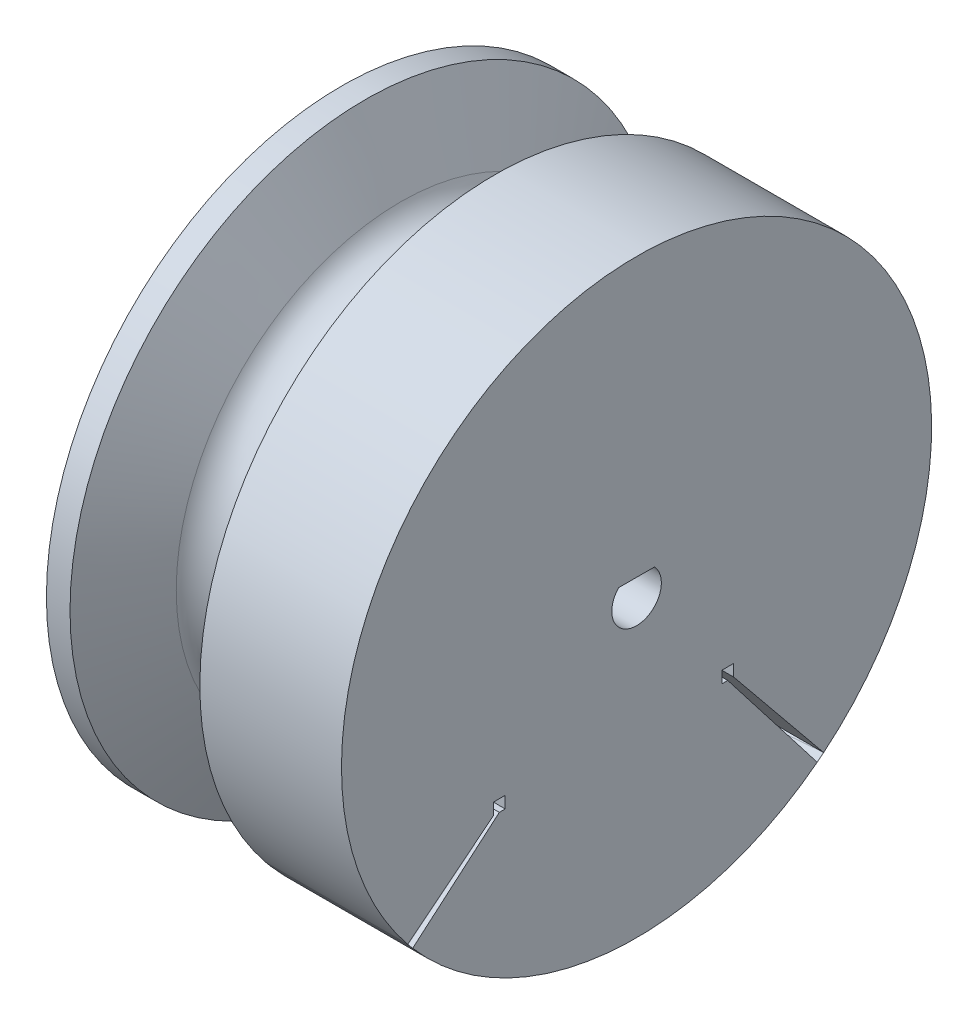
ISO-10303-21;
HEADER;
FILE_DESCRIPTION(('STEP AP214'),'2;1');
FILE_NAME('part.step','',(''),(''),'','','');
FILE_SCHEMA(('AUTOMOTIVE_DESIGN { 1 0 10303 214 1 1 1 1 }'));
ENDSEC;
DATA;
#1=APPLICATION_CONTEXT('core data for automotive mechanical design processes');
#2=APPLICATION_PROTOCOL_DEFINITION('international standard','automotive_design',2000,#1);
#3=PRODUCT_CONTEXT('',#1,'mechanical');
#4=PRODUCT('Part','Part','',(#3));
#5=PRODUCT_RELATED_PRODUCT_CATEGORY('part','',(#4));
#6=PRODUCT_DEFINITION_FORMATION('','',#4);
#7=PRODUCT_DEFINITION_CONTEXT('part definition',#1,'design');
#8=PRODUCT_DEFINITION('design','',#6,#7);
#9=PRODUCT_DEFINITION_SHAPE('','',#8);
#10=(LENGTH_UNIT() NAMED_UNIT(*) SI_UNIT(.MILLI.,.METRE.));
#11=(NAMED_UNIT(*) PLANE_ANGLE_UNIT() SI_UNIT($,.RADIAN.));
#12=(NAMED_UNIT(*) SI_UNIT($,.STERADIAN.) SOLID_ANGLE_UNIT());
#13=UNCERTAINTY_MEASURE_WITH_UNIT(LENGTH_MEASURE(1.E-05),#10,'distance_accuracy_value','');
#14=(GEOMETRIC_REPRESENTATION_CONTEXT(3) GLOBAL_UNCERTAINTY_ASSIGNED_CONTEXT((#13)) GLOBAL_UNIT_ASSIGNED_CONTEXT((#10,
#11,#12)) REPRESENTATION_CONTEXT('',''));
#15=CARTESIAN_POINT('',(0.,0.,0.));
#16=DIRECTION('',(0.,0.,1.));
#17=DIRECTION('',(1.,0.,0.));
#18=AXIS2_PLACEMENT_3D('',#15,#16,#17);
#19=CARTESIAN_POINT('',(5.95223912932069,-20.2543845102429,0.));
#20=DIRECTION('',(1.,0.,0.));
#21=DIRECTION('',(0.,0.,-1.));
#22=AXIS2_PLACEMENT_3D('',#19,#20,#21);
#23=CONICAL_SURFACE('',#22,25.,1.10714871779409);
#24=DIRECTION('',(0.447213595499958,-0.582494126899903,0.678749285176139));
#25=VECTOR('',#24,1.);
#26=CARTESIAN_POINT('',(-6.54776087067931,-20.2543845102429,0.));
#27=LINE('',#26,#25);
#28=CARTESIAN_POINT('',(2.95223912932069,-32.6281009205473,14.4184306426658));
#29=VERTEX_POINT('',#28);
#30=CARTESIAN_POINT('',(5.95223912932069,-36.5355903132751,18.9716192666655));
#31=VERTEX_POINT('',#30);
#32=EDGE_CURVE('E241',#29,#31,#27,.T.);
#33=ORIENTED_EDGE('',*,*,#32,.F.);
#34=CARTESIAN_POINT('',(2.95223912932069,-20.2543845102429,0.));
#35=DIRECTION('',(-1.,0.,0.));
#36=DIRECTION('',(0.,0.,1.));
#37=AXIS2_PLACEMENT_3D('',#34,#35,#36);
#38=CIRCLE('',#37,19.);
#39=CARTESIAN_POINT('',(2.95223912932069,-35.2771306126539,-11.6325878265541));
#40=VERTEX_POINT('',#39);
#41=EDGE_CURVE('E296',#40,#29,#38,.T.);
#42=ORIENTED_EDGE('',*,*,#41,.F.);
#43=DIRECTION('',(0.447213595499958,-0.70719750513076,-0.54760541335603));
#44=VECTOR('',#43,1.);
#45=CARTESIAN_POINT('',(-6.54776087067931,-20.2543845102429,0.));
#46=LINE('',#45,#44);
#47=CARTESIAN_POINT('',(5.95223912932069,-40.0211556976259,-15.3060366138869));
#48=VERTEX_POINT('',#47);
#49=EDGE_CURVE('E236',#40,#48,#46,.T.);
#50=ORIENTED_EDGE('',*,*,#49,.T.);
#51=CARTESIAN_POINT('',(5.95223912932069,-20.2543845102429,0.));
#52=DIRECTION('',(-1.,0.,0.));
#53=DIRECTION('',(0.,0.,1.));
#54=AXIS2_PLACEMENT_3D('',#51,#52,#53);
#55=CIRCLE('',#54,25.);
#56=EDGE_CURVE('E232',#48,#31,#55,.T.);
#57=ORIENTED_EDGE('',*,*,#56,.T.);
#58=EDGE_LOOP('',(#33,#42,#50,#57));
#59=FACE_BOUND('',#58,.T.);
#60=ADVANCED_FACE('F58',(#59),#23,.T.);
#61=CARTESIAN_POINT('',(2.95223912932069,-32.2899457175812,14.7018796901761));
#62=VERTEX_POINT('',#61);
#63=CARTESIAN_POINT('',(2.95223912932069,-34.9358397848445,-12.0604672803285));
#64=VERTEX_POINT('',#63);
#65=EDGE_CURVE('E230',#62,#64,#38,.T.);
#66=ORIENTED_EDGE('',*,*,#65,.F.);
#67=CARTESIAN_POINT('',(2.95203912932069,-32.2896960037365,14.7015671754606));
#68=CARTESIAN_POINT('',(3.45208797742342,-32.9140401727626,15.482928499545));
#69=CARTESIAN_POINT('',(3.95213973462226,-33.5383834338488,16.2642886873505));
#70=CARTESIAN_POINT('',(4.95224906721098,-34.7870681401401,17.8270067904019));
#71=CARTESIAN_POINT('',(5.45230664260087,-35.4114095853451,18.6083647056479));
#72=CARTESIAN_POINT('',(5.95236712708686,-36.0357501226103,19.3897214846149));
#73=B_SPLINE_CURVE_WITH_KNOTS('',3,(#67,#68,#69,#70,#71,#72),.UNSPECIFIED.,.F.,.F.,(4,2,4),(0.,
3.35461176526577,6.70922353052379),.UNSPECIFIED.);
#74=CARTESIAN_POINT('',(5.95223912932069,-36.0355903132751,19.3895214846149));
#75=VERTEX_POINT('',#74);
#76=EDGE_CURVE('E208',#62,#75,#73,.T.);
#77=ORIENTED_EDGE('',*,*,#76,.T.);
#78=CARTESIAN_POINT('',(5.95223912932069,-39.586438452329,-15.8515516710597));
#79=VERTEX_POINT('',#78);
#80=EDGE_CURVE('E220',#75,#79,#55,.T.);
#81=ORIENTED_EDGE('',*,*,#80,.T.);
#82=CARTESIAN_POINT('',(2.95203912932069,-34.9355297444045,-12.0602145409381));
#83=CARTESIAN_POINT('',(3.45209337602438,-35.7107147574259,-12.6921314215197));
#84=CARTESIAN_POINT('',(3.95214791736082,-36.4858996562637,-13.324048209021));
#85=CARTESIAN_POINT('',(4.95225758929918,-38.0362692255718,-14.5878815978625));
#86=CARTESIAN_POINT('',(5.4523127199011,-38.8114538960422,-15.2197981992028));
#87=CARTESIAN_POINT('',(5.95236814513577,-39.586638452329,-15.8517147074626));
#88=B_SPLINE_CURVE_WITH_KNOTS('',3,(#82,#83,#84,#85,#86,#87),.UNSPECIFIED.,.F.,.F.,(4,2,4),(0.,
3.35448430942943,6.70896861885878),.UNSPECIFIED.);
#89=EDGE_CURVE('E452',#64,#79,#88,.T.);
#90=ORIENTED_EDGE('',*,*,#89,.F.);
#91=EDGE_LOOP('',(#66,#77,#81,#90));
#92=FACE_BOUND('',#91,.T.);
#93=ADVANCED_FACE('F228',(#92),#23,.T.);
#94=CARTESIAN_POINT('',(0.452239129320693,-20.2543845102429,0.));
#95=DIRECTION('',(-1.,0.,0.));
#96=DIRECTION('',(0.,0.,1.));
#97=AXIS2_PLACEMENT_3D('',#94,#95,#96);
#98=TOROIDAL_SURFACE('',#97,20.1628386592195,2.75720759961511);
#99=CARTESIAN_POINT('',(-2.0477608706793,-20.2543845102429,0.));
#100=DIRECTION('',(-1.,0.,0.));
#101=DIRECTION('',(0.,0.,1.));
#102=AXIS2_PLACEMENT_3D('',#99,#100,#101);
#103=CIRCLE('',#102,19.);
#104=CARTESIAN_POINT('',(-2.0477608706793,-20.2543845102429,19.));
#105=VERTEX_POINT('',#104);
#106=EDGE_CURVE('E607',#105,#105,#103,.T.);
#107=ORIENTED_EDGE('',*,*,#106,.F.);
#108=EDGE_LOOP('',(#107));
#109=FACE_BOUND('',#108,.T.);
#110=CARTESIAN_POINT('',(0.452239129320693,-33.3853975416063,15.3008679351166));
#111=DIRECTION('',(0.,0.758864770666619,0.651248232121286));
#112=DIRECTION('',(0.,-0.651248232121286,0.758864770666619));
#113=AXIS2_PLACEMENT_3D('',#110,#111,#112);
#114=CIRCLE('',#113,2.75720759961511);
#115=CARTESIAN_POINT('',(0.952239129320699,-31.6195425839968,13.2432114973065));
#116=VERTEX_POINT('',#115);
#117=EDGE_CURVE('E255',#116,#29,#114,.F.);
#118=ORIENTED_EDGE('',*,*,#117,.F.);
#119=CARTESIAN_POINT('',(0.952239129320699,-20.2543845102429,0.));
#120=DIRECTION('',(-1.,0.,0.));
#121=DIRECTION('',(0.,0.,1.));
#122=AXIS2_PLACEMENT_3D('',#119,#120,#121);
#123=CIRCLE('',#122,17.4513457591042);
#124=CARTESIAN_POINT('',(0.952239129320699,-31.3231386879366,13.4919290599082));
#125=VERTEX_POINT('',#124);
#126=EDGE_CURVE('E77',#125,#116,#123,.F.);
#127=ORIENTED_EDGE('',*,*,#126,.F.);
#128=CARTESIAN_POINT('',(0.952039129320698,-31.3231156687494,13.4919002515946));
#129=CARTESIAN_POINT('',(1.02831601984826,-31.3318882776971,13.5028790957692));
#130=CARTESIAN_POINT('',(1.10399344462594,-31.3426788747578,13.5163834346023));
#131=CARTESIAN_POINT('',(1.25362138472117,-31.3681987044236,13.5483212805651));
#132=CARTESIAN_POINT('',(1.3275719685214,-31.382927780548,13.5667545918604));
#133=CARTESIAN_POINT('',(1.47314627345118,-31.4162100799031,13.6084071014582));
#134=CARTESIAN_POINT('',(1.54477240546026,-31.4347591841156,13.631621144845));
#135=CARTESIAN_POINT('',(1.68525121095544,-31.4755465712218,13.6826662068097));
#136=CARTESIAN_POINT('',(1.75410394625501,-31.4977847718363,13.7104971224159));
#137=CARTESIAN_POINT('',(1.95587017260049,-31.569853126741,13.800690044856));
#138=CARTESIAN_POINT('',(2.08400850972081,-31.6250408913497,13.8697570546356));
#139=CARTESIAN_POINT('',(2.32350467007231,-31.7480167197712,14.023660239598));
#140=CARTESIAN_POINT('',(2.43486966422778,-31.8157993711865,14.1084896412122));
#141=CARTESIAN_POINT('',(2.62017194099709,-31.9493549988879,14.2756333534094));
#142=CARTESIAN_POINT('',(2.69725043913725,-32.0134335224504,14.3558270710736));
#143=CARTESIAN_POINT('',(2.80159369887816,-32.1140537486118,14.4817524132862));
#144=CARTESIAN_POINT('',(2.83450423045748,-32.1483556619762,14.5246809609923));
#145=CARTESIAN_POINT('',(2.89642880236663,-32.2183103235882,14.6122286145699));
#146=CARTESIAN_POINT('',(2.9254422665473,-32.2539632705783,14.6568479691657));
#147=CARTESIAN_POINT('',(2.95243912931956,-32.2902142092784,14.7022157052115));
#148=B_SPLINE_CURVE_WITH_KNOTS('',3,(#128,#129,#130,#131,#132,#133,#134,#135,#136,#137,#138,
#139,#140,#141,#142,#143,#144,#145,#146,#147),.UNSPECIFIED.,.F.,.F.,(4,2,2,2,2,2,2,2,2,4),(0.,
0.232606380571402,0.46520352076871,0.697551159613351,0.929893617024674,1.39452543716047,
1.85895805102427,2.2427528809881,2.43477042269168,2.62681632142748),.UNSPECIFIED.);
#149=EDGE_CURVE('E225',#125,#62,#148,.T.);
#150=ORIENTED_EDGE('',*,*,#149,.T.);
#151=ORIENTED_EDGE('',*,*,#65,.T.);
#152=CARTESIAN_POINT('',(0.952039129320696,-33.7354468427902,-11.0819285435453));
#153=CARTESIAN_POINT('',(1.02831804717177,-33.7463389290374,-11.0908075763553));
#154=CARTESIAN_POINT('',(1.1039975610392,-33.7597366284696,-11.1017291399691));
#155=CARTESIAN_POINT('',(1.25362981955951,-33.791422462738,-11.1275588621814));
#156=CARTESIAN_POINT('',(1.32758263218044,-33.8097104047258,-11.1424668635734));
#157=CARTESIAN_POINT('',(1.47316177455625,-33.851034712286,-11.1761536958612));
#158=CARTESIAN_POINT('',(1.54479050671636,-33.8740659811037,-11.1949283719741));
#159=CARTESIAN_POINT('',(1.68527455178815,-33.9247093883307,-11.2362119667023));
#160=CARTESIAN_POINT('',(1.75412992671949,-33.9523214242312,-11.2587208017541));
#161=CARTESIAN_POINT('',(1.95590425367903,-34.0418055272445,-11.3316666331207));
#162=CARTESIAN_POINT('',(2.08404800662264,-34.1103303141803,-11.3875268069833));
#163=CARTESIAN_POINT('',(2.32355371568324,-34.2630265278031,-11.512002014022));
#164=CARTESIAN_POINT('',(2.4349228787153,-34.347191200165,-11.5806115411938));
#165=CARTESIAN_POINT('',(2.62021515187732,-34.5130123225329,-11.7157859377845));
#166=CARTESIAN_POINT('',(2.69728234518253,-34.5925629181724,-11.7806341525984));
#167=CARTESIAN_POINT('',(2.80161150410458,-34.7174782133034,-11.8824628545343));
#168=CARTESIAN_POINT('',(2.8345178318226,-34.7600624385148,-11.9171767490312));
#169=CARTESIAN_POINT('',(2.89643491751458,-34.8469078639291,-11.9879715778768));
#170=CARTESIAN_POINT('',(2.92544509850469,-34.8911693112716,-12.0240527136894));
#171=CARTESIAN_POINT('',(2.95243912932069,-34.9361731395478,-12.0607390250871));
#172=B_SPLINE_CURVE_WITH_KNOTS('',3,(#152,#153,#154,#155,#156,#157,#158,#159,#160,#161,#162,
#163,#164,#165,#166,#167,#168,#169,#170,#171),.UNSPECIFIED.,.F.,.F.,(4,2,2,2,2,2,2,2,2,4),(0.,
0.232612010065071,0.465214848348382,0.697569044342117,0.929918041388333,1.39456365715096,
1.8590090729519,2.24274310880745,2.43473053355454,2.62674635861386),.UNSPECIFIED.);
#173=CARTESIAN_POINT('',(0.952239129320699,-33.7354754226854,-11.0819518413619));
#174=VERTEX_POINT('',#173);
#175=EDGE_CURVE('E540',#174,#64,#172,.T.);
#176=ORIENTED_EDGE('',*,*,#175,.F.);
#177=CARTESIAN_POINT('',(0.952239129320699,-20.2543845102429,0.));
#178=DIRECTION('',(-1.,0.,0.));
#179=DIRECTION('',(0.,0.,1.));
#180=AXIS2_PLACEMENT_3D('',#177,#178,#179);
#181=CIRCLE('',#180,17.4513457591042);
#182=CARTESIAN_POINT('',(0.952239129320699,-34.0526548515277,-10.684437486018));
#183=VERTEX_POINT('',#182);
#184=EDGE_CURVE('E370',#183,#174,#181,.F.);
#185=ORIENTED_EDGE('',*,*,#184,.F.);
#186=CARTESIAN_POINT('',(0.452239129320693,-36.1965532408393,-12.3445258703163));
#187=DIRECTION('',(0.,-0.612241464555478,0.790670847495318));
#188=DIRECTION('',(0.,-0.790670847495318,-0.612241464555478));
#189=AXIS2_PLACEMENT_3D('',#186,#187,#188);
#190=CIRCLE('',#189,2.75720759961511);
#191=EDGE_CURVE('E306',#183,#40,#190,.F.);
#192=ORIENTED_EDGE('',*,*,#191,.T.);
#193=ORIENTED_EDGE('',*,*,#41,.T.);
#194=EDGE_LOOP('',(#118,#127,#150,#151,#176,#185,#192,#193));
#195=FACE_BOUND('',#194,.T.);
#196=ADVANCED_FACE('F291',(#109,#195),#98,.F.);
#197=CARTESIAN_POINT('',(-20.8444071831921,-20.2543845102429,0.));
#198=DIRECTION('',(-1.,0.,0.));
#199=DIRECTION('',(0.,0.,1.));
#200=AXIS2_PLACEMENT_3D('',#197,#198,#199);
#201=CYLINDRICAL_SURFACE('',#200,25.);
#202=CARTESIAN_POINT('',(17.9522391293207,-20.2543845102429,0.));
#203=DIRECTION('',(1.,0.,0.));
#204=DIRECTION('',(0.,0.,-1.));
#205=AXIS2_PLACEMENT_3D('',#202,#203,#204);
#206=CIRCLE('',#205,25.);
#207=CARTESIAN_POINT('',(17.9522391293207,-36.5355903132751,18.9716192666655));
#208=VERTEX_POINT('',#207);
#209=CARTESIAN_POINT('',(17.9522391293207,-40.0211556976259,-15.3060366138869));
#210=VERTEX_POINT('',#209);
#211=EDGE_CURVE('E366',#208,#210,#206,.T.);
#212=ORIENTED_EDGE('',*,*,#211,.F.);
#213=DIRECTION('',(-1.,0.,0.));
#214=VECTOR('',#213,1.);
#215=CARTESIAN_POINT('',(-20.8444071831921,-36.535590313275,18.9716192666655));
#216=LINE('',#215,#214);
#217=EDGE_CURVE('E308',#208,#31,#216,.T.);
#218=ORIENTED_EDGE('',*,*,#217,.T.);
#219=ORIENTED_EDGE('',*,*,#56,.F.);
#220=DIRECTION('',(-1.,0.,0.));
#221=VECTOR('',#220,1.);
#222=CARTESIAN_POINT('',(-20.8444071831921,-40.0211556976259,-15.3060366138869));
#223=LINE('',#222,#221);
#224=EDGE_CURVE('E434',#210,#48,#223,.T.);
#225=ORIENTED_EDGE('',*,*,#224,.F.);
#226=EDGE_LOOP('',(#212,#218,#219,#225));
#227=FACE_BOUND('',#226,.T.);
#228=ADVANCED_FACE('F490',(#227),#201,.T.);
#229=CARTESIAN_POINT('',(17.9522391293207,-20.2543845102429,0.));
#230=DIRECTION('',(1.,0.,0.));
#231=DIRECTION('',(0.,0.,-1.));
#232=AXIS2_PLACEMENT_3D('',#229,#230,#231);
#233=PLANE('',#232);
#234=CARTESIAN_POINT('',(17.9522391293207,-20.2543845102429,0.));
#235=DIRECTION('',(1.,0.,0.));
#236=DIRECTION('',(0.,0.,-1.));
#237=AXIS2_PLACEMENT_3D('',#234,#235,#236);
#238=CIRCLE('',#237,2.1);
#239=CARTESIAN_POINT('',(17.9522391293207,-18.8025326583911,1.51727591435255));
#240=VERTEX_POINT('',#239);
#241=CARTESIAN_POINT('',(17.9522391293207,-18.8025326583911,-1.51727591435255));
#242=VERTEX_POINT('',#241);
#243=EDGE_CURVE('E459',#240,#242,#238,.T.);
#244=ORIENTED_EDGE('',*,*,#243,.F.);
#245=DIRECTION('',(0.,0.,1.));
#246=VECTOR('',#245,1.);
#247=CARTESIAN_POINT('',(17.9522391293207,-18.8025326583911,1.51727591435255));
#248=LINE('',#247,#246);
#249=EDGE_CURVE('E469',#242,#240,#248,.T.);
#250=ORIENTED_EDGE('',*,*,#249,.F.);
#251=EDGE_LOOP('',(#244,#250));
#252=FACE_BOUND('',#251,.T.);
#253=DIRECTION('',(0.,0.,-1.));
#254=VECTOR('',#253,1.);
#255=CARTESIAN_POINT('',(17.9522391293207,-29.2320443047324,0.));
#256=LINE('',#255,#254);
#257=CARTESIAN_POINT('',(17.9522391293207,-29.2320443047324,12.1264338823183));
#258=VERTEX_POINT('',#257);
#259=CARTESIAN_POINT('',(17.9522391293207,-29.2320443047324,11.1264338823183));
#260=VERTEX_POINT('',#259);
#261=EDGE_CURVE('E312',#258,#260,#256,.T.);
#262=ORIENTED_EDGE('',*,*,#261,.T.);
#263=DIRECTION('',(0.,-1.,0.));
#264=VECTOR('',#263,1.);
#265=CARTESIAN_POINT('',(17.9522391293207,-20.2543845102429,11.1264338823183));
#266=LINE('',#265,#264);
#267=CARTESIAN_POINT('',(17.9522391293207,-30.2320443047324,11.1264338823183));
#268=VERTEX_POINT('',#267);
#269=EDGE_CURVE('E355',#260,#268,#266,.T.);
#270=ORIENTED_EDGE('',*,*,#269,.T.);
#271=DIRECTION('',(0.,0.,-1.));
#272=VECTOR('',#271,1.);
#273=CARTESIAN_POINT('',(17.9522391293207,-30.2320443047324,0.));
#274=LINE('',#273,#272);
#275=CARTESIAN_POINT('',(17.9522391293207,-30.2320443047324,11.6264338823183));
#276=VERTEX_POINT('',#275);
#277=EDGE_CURVE('E176',#276,#268,#274,.T.);
#278=ORIENTED_EDGE('',*,*,#277,.F.);
#279=DIRECTION('',(0.,-0.651248232121286,0.758864770666619));
#280=VECTOR('',#279,1.);
#281=CARTESIAN_POINT('',(17.9522391293207,-20.2543845102429,0.));
#282=LINE('',#281,#280);
#283=EDGE_CURVE('E362',#276,#208,#282,.T.);
#284=ORIENTED_EDGE('',*,*,#283,.T.);
#285=ORIENTED_EDGE('',*,*,#211,.T.);
#286=DIRECTION('',(0.,-0.790670847495318,-0.612241464555478));
#287=VECTOR('',#286,1.);
#288=CARTESIAN_POINT('',(17.9522391293207,-20.2543845102429,0.));
#289=LINE('',#288,#287);
#290=CARTESIAN_POINT('',(17.9522391293207,-30.2320443047324,-7.72601780471071));
#291=VERTEX_POINT('',#290);
#292=EDGE_CURVE('E431',#291,#210,#289,.T.);
#293=ORIENTED_EDGE('',*,*,#292,.F.);
#294=DIRECTION('',(0.,0.,-1.));
#295=VECTOR('',#294,1.);
#296=CARTESIAN_POINT('',(17.9522391293207,-30.2320443047324,0.));
#297=LINE('',#296,#295);
#298=CARTESIAN_POINT('',(17.9522391293207,-30.2320443047324,-7.22601780471071));
#299=VERTEX_POINT('',#298);
#300=EDGE_CURVE('E381',#299,#291,#297,.T.);
#301=ORIENTED_EDGE('',*,*,#300,.F.);
#302=DIRECTION('',(0.,-1.,0.));
#303=VECTOR('',#302,1.);
#304=CARTESIAN_POINT('',(17.9522391293207,-20.2543845102429,-7.22601780471071));
#305=LINE('',#304,#303);
#306=CARTESIAN_POINT('',(17.9522391293207,-29.2320443047324,-7.22601780471071));
#307=VERTEX_POINT('',#306);
#308=EDGE_CURVE('E386',#307,#299,#305,.T.);
#309=ORIENTED_EDGE('',*,*,#308,.F.);
#310=DIRECTION('',(0.,0.,-1.));
#311=VECTOR('',#310,1.);
#312=CARTESIAN_POINT('',(17.9522391293207,-29.2320443047324,0.));
#313=LINE('',#312,#311);
#314=CARTESIAN_POINT('',(17.9522391293207,-29.2320443047324,-8.22601780471071));
#315=VERTEX_POINT('',#314);
#316=EDGE_CURVE('E380',#307,#315,#313,.T.);
#317=ORIENTED_EDGE('',*,*,#316,.T.);
#318=DIRECTION('',(0.,-1.,0.));
#319=VECTOR('',#318,1.);
#320=CARTESIAN_POINT('',(17.9522391293207,-20.2543845102429,-8.22601780471071));
#321=LINE('',#320,#319);
#322=CARTESIAN_POINT('',(17.9522391293207,-30.2320443047324,-8.22601780471071));
#323=VERTEX_POINT('',#322);
#324=EDGE_CURVE('E375',#315,#323,#321,.T.);
#325=ORIENTED_EDGE('',*,*,#324,.T.);
#326=DIRECTION('',(0.,-0.775095592154548,-0.6318439862993));
#327=VECTOR('',#326,1.);
#328=CARTESIAN_POINT('',(17.9522391293207,-20.2091281773992,-0.0555168441337386));
#329=LINE('',#328,#327);
#330=CARTESIAN_POINT('',(17.9522391293207,-39.586438452329,-15.8515516710597));
#331=VERTEX_POINT('',#330);
#332=EDGE_CURVE('E379',#323,#331,#329,.T.);
#333=ORIENTED_EDGE('',*,*,#332,.T.);
#334=CARTESIAN_POINT('',(17.9522391293207,-36.0355903132751,19.3895214846149));
#335=VERTEX_POINT('',#334);
#336=EDGE_CURVE('E421',#331,#335,#206,.T.);
#337=ORIENTED_EDGE('',*,*,#336,.T.);
#338=DIRECTION('',(0.,-0.624240815734114,0.78123197833397));
#339=VECTOR('',#338,1.);
#340=CARTESIAN_POINT('',(17.9522391293207,-20.4302022682981,-0.140486595214604));
#341=LINE('',#340,#339);
#342=CARTESIAN_POINT('',(17.9522391293207,-30.2320443047324,12.1264338823183));
#343=VERTEX_POINT('',#342);
#344=EDGE_CURVE('E212',#343,#335,#341,.T.);
#345=ORIENTED_EDGE('',*,*,#344,.F.);
#346=DIRECTION('',(0.,-1.,0.));
#347=VECTOR('',#346,1.);
#348=CARTESIAN_POINT('',(17.9522391293207,-20.2543845102429,12.1264338823183));
#349=LINE('',#348,#347);
#350=EDGE_CURVE('E339',#258,#343,#349,.T.);
#351=ORIENTED_EDGE('',*,*,#350,.F.);
#352=EDGE_LOOP('',(#262,#270,#278,#284,#285,#293,#301,#309,#317,#325,#333,#337,#345,#351));
#353=FACE_BOUND('',#352,.T.);
#354=ADVANCED_FACE('F358',(#252,#353),#233,.T.);
#355=CARTESIAN_POINT('',(-5.0477608706793,-20.2543845102429,0.));
#356=DIRECTION('',(-1.,0.,0.));
#357=DIRECTION('',(0.,0.,1.));
#358=AXIS2_PLACEMENT_3D('',#355,#356,#357);
#359=CONICAL_SURFACE('',#358,25.,1.10714871779409);
#360=ORIENTED_EDGE('',*,*,#106,.T.);
#361=EDGE_LOOP('',(#360));
#362=FACE_BOUND('',#361,.T.);
#363=CARTESIAN_POINT('',(-5.0477608706793,-20.2543845102429,0.));
#364=DIRECTION('',(-1.,0.,0.));
#365=DIRECTION('',(0.,0.,1.));
#366=AXIS2_PLACEMENT_3D('',#363,#364,#365);
#367=CIRCLE('',#366,25.);
#368=CARTESIAN_POINT('',(-5.0477608706793,-20.2543845102429,25.));
#369=VERTEX_POINT('',#368);
#370=EDGE_CURVE('E411',#369,#369,#367,.T.);
#371=ORIENTED_EDGE('',*,*,#370,.F.);
#372=EDGE_LOOP('',(#371));
#373=FACE_BOUND('',#372,.T.);
#374=ADVANCED_FACE('F489',(#362,#373),#359,.T.);
#375=CARTESIAN_POINT('',(-20.8444071831921,-20.2543845102429,0.));
#376=DIRECTION('',(-1.,0.,0.));
#377=DIRECTION('',(0.,0.,1.));
#378=AXIS2_PLACEMENT_3D('',#375,#376,#377);
#379=CYLINDRICAL_SURFACE('',#378,25.);
#380=ORIENTED_EDGE('',*,*,#370,.T.);
#381=EDGE_LOOP('',(#380));
#382=FACE_BOUND('',#381,.T.);
#383=CARTESIAN_POINT('',(-7.04776087067931,-20.2543845102429,0.));
#384=DIRECTION('',(-1.,0.,0.));
#385=DIRECTION('',(0.,0.,1.));
#386=AXIS2_PLACEMENT_3D('',#383,#384,#385);
#387=CIRCLE('',#386,25.);
#388=CARTESIAN_POINT('',(-7.04776087067931,-20.2543845102429,25.));
#389=VERTEX_POINT('',#388);
#390=EDGE_CURVE('E405',#389,#389,#387,.T.);
#391=ORIENTED_EDGE('',*,*,#390,.F.);
#392=EDGE_LOOP('',(#391));
#393=FACE_BOUND('',#392,.T.);
#394=ADVANCED_FACE('F496',(#382,#393),#379,.T.);
#395=CARTESIAN_POINT('',(-7.04776087067931,0.,0.));
#396=DIRECTION('',(1.,0.,0.));
#397=DIRECTION('',(0.,0.,-1.));
#398=AXIS2_PLACEMENT_3D('',#395,#396,#397);
#399=PLANE('',#398);
#400=CARTESIAN_POINT('',(-7.04776087067931,-20.2543845102429,0.));
#401=DIRECTION('',(-1.,0.,0.));
#402=DIRECTION('',(0.,0.,1.));
#403=AXIS2_PLACEMENT_3D('',#400,#401,#402);
#404=CIRCLE('',#403,10.95);
#405=CARTESIAN_POINT('',(-7.04776087067931,-20.2543845102429,10.95));
#406=VERTEX_POINT('',#405);
#407=EDGE_CURVE('E395',#406,#406,#404,.T.);
#408=ORIENTED_EDGE('',*,*,#407,.F.);
#409=EDGE_LOOP('',(#408));
#410=FACE_BOUND('',#409,.T.);
#411=ORIENTED_EDGE('',*,*,#390,.T.);
#412=EDGE_LOOP('',(#411));
#413=FACE_BOUND('',#412,.T.);
#414=ADVANCED_FACE('F618',(#410,#413),#399,.F.);
#415=DIRECTION('',(-1.,0.,0.));
#416=VECTOR('',#415,1.);
#417=CARTESIAN_POINT('',(-20.8444071831921,-36.0355903132751,19.3895214846149));
#418=LINE('',#417,#416);
#419=EDGE_CURVE('E204',#335,#75,#418,.T.);
#420=ORIENTED_EDGE('',*,*,#419,.F.);
#421=ORIENTED_EDGE('',*,*,#336,.F.);
#422=DIRECTION('',(-1.,0.,0.));
#423=VECTOR('',#422,1.);
#424=CARTESIAN_POINT('',(-20.8444071831921,-39.5864384523294,-15.8515516710592));
#425=LINE('',#424,#423);
#426=EDGE_CURVE('E221',#79,#331,#425,.F.);
#427=ORIENTED_EDGE('',*,*,#426,.F.);
#428=ORIENTED_EDGE('',*,*,#80,.F.);
#429=EDGE_LOOP('',(#420,#421,#427,#428));
#430=FACE_BOUND('',#429,.T.);
#431=ADVANCED_FACE('F60',(#430),#201,.T.);
#432=CARTESIAN_POINT('',(-0.247760870679308,-20.2543845102429,0.));
#433=DIRECTION('',(-1.,0.,0.));
#434=DIRECTION('',(0.,0.,1.));
#435=AXIS2_PLACEMENT_3D('',#432,#433,#434);
#436=PLANE('',#435);
#437=CARTESIAN_POINT('',(-0.247760870679308,-20.2543845102429,0.));
#438=DIRECTION('',(-1.,0.,0.));
#439=DIRECTION('',(0.,0.,1.));
#440=AXIS2_PLACEMENT_3D('',#437,#438,#439);
#441=CIRCLE('',#440,10.95);
#442=CARTESIAN_POINT('',(-0.247760870679308,-20.2543845102429,10.95));
#443=VERTEX_POINT('',#442);
#444=EDGE_CURVE('E396',#443,#443,#441,.T.);
#445=ORIENTED_EDGE('',*,*,#444,.T.);
#446=EDGE_LOOP('',(#445));
#447=FACE_BOUND('',#446,.T.);
#448=CARTESIAN_POINT('',(-0.247760870679308,-20.2543845102429,0.));
#449=DIRECTION('',(-1.,0.,0.));
#450=DIRECTION('',(0.,0.,1.));
#451=AXIS2_PLACEMENT_3D('',#448,#449,#450);
#452=CIRCLE('',#451,3.95);
#453=CARTESIAN_POINT('',(-0.247760870679308,-20.2543845102429,3.95));
#454=VERTEX_POINT('',#453);
#455=EDGE_CURVE('E392',#454,#454,#452,.F.);
#456=ORIENTED_EDGE('',*,*,#455,.T.);
#457=EDGE_LOOP('',(#456));
#458=FACE_BOUND('',#457,.T.);
#459=ADVANCED_FACE('F502',(#447,#458),#436,.T.);
#460=CARTESIAN_POINT('',(-0.247760870679308,-20.2543845102429,0.));
#461=DIRECTION('',(-1.,0.,0.));
#462=DIRECTION('',(0.,0.,1.));
#463=AXIS2_PLACEMENT_3D('',#460,#461,#462);
#464=CYLINDRICAL_SURFACE('',#463,10.95);
#465=ORIENTED_EDGE('',*,*,#444,.F.);
#466=EDGE_LOOP('',(#465));
#467=FACE_BOUND('',#466,.T.);
#468=ORIENTED_EDGE('',*,*,#407,.T.);
#469=EDGE_LOOP('',(#468));
#470=FACE_BOUND('',#469,.T.);
#471=ADVANCED_FACE('F635',(#467,#470),#464,.F.);
#472=CARTESIAN_POINT('',(6.95223912932069,-20.2543845102429,0.));
#473=DIRECTION('',(-1.,0.,0.));
#474=DIRECTION('',(0.,0.,1.));
#475=AXIS2_PLACEMENT_3D('',#472,#473,#474);
#476=PLANE('',#475);
#477=CARTESIAN_POINT('',(6.95223912932069,-20.2543845102429,0.));
#478=DIRECTION('',(-1.,0.,0.));
#479=DIRECTION('',(0.,0.,1.));
#480=AXIS2_PLACEMENT_3D('',#477,#478,#479);
#481=CIRCLE('',#480,3.95);
#482=CARTESIAN_POINT('',(6.95223912932069,-20.2543845102429,3.95));
#483=VERTEX_POINT('',#482);
#484=EDGE_CURVE('E402',#483,#483,#481,.T.);
#485=ORIENTED_EDGE('',*,*,#484,.T.);
#486=EDGE_LOOP('',(#485));
#487=FACE_BOUND('',#486,.T.);
#488=ADVANCED_FACE('F632',(#487),#476,.T.);
#489=CARTESIAN_POINT('',(6.95223912932069,-20.2543845102429,0.));
#490=DIRECTION('',(-1.,0.,0.));
#491=DIRECTION('',(0.,0.,1.));
#492=AXIS2_PLACEMENT_3D('',#489,#490,#491);
#493=CYLINDRICAL_SURFACE('',#492,3.95);
#494=ORIENTED_EDGE('',*,*,#484,.F.);
#495=EDGE_LOOP('',(#494));
#496=FACE_BOUND('',#495,.T.);
#497=ORIENTED_EDGE('',*,*,#455,.F.);
#498=EDGE_LOOP('',(#497));
#499=FACE_BOUND('',#498,.T.);
#500=ADVANCED_FACE('F507',(#496,#499),#493,.F.);
#501=CARTESIAN_POINT('',(11.9522391293207,-20.2543845102429,0.));
#502=DIRECTION('',(1.,0.,0.));
#503=DIRECTION('',(0.,0.,-1.));
#504=AXIS2_PLACEMENT_3D('',#501,#502,#503);
#505=CYLINDRICAL_SURFACE('',#504,2.1);
#506=ORIENTED_EDGE('',*,*,#243,.T.);
#507=DIRECTION('',(1.,0.,0.));
#508=VECTOR('',#507,1.);
#509=CARTESIAN_POINT('',(11.9522391293207,-18.8025326583911,-1.51727591435255));
#510=LINE('',#509,#508);
#511=CARTESIAN_POINT('',(11.9522391293207,-18.8025326583911,-1.51727591435255));
#512=VERTEX_POINT('',#511);
#513=EDGE_CURVE('E417',#512,#242,#510,.T.);
#514=ORIENTED_EDGE('',*,*,#513,.F.);
#515=CARTESIAN_POINT('',(11.9522391293207,-20.2543845102429,0.));
#516=DIRECTION('',(1.,0.,0.));
#517=DIRECTION('',(0.,0.,-1.));
#518=AXIS2_PLACEMENT_3D('',#515,#516,#517);
#519=CIRCLE('',#518,2.1);
#520=CARTESIAN_POINT('',(11.9522391293207,-18.8025326583911,1.51727591435255));
#521=VERTEX_POINT('',#520);
#522=EDGE_CURVE('E475',#521,#512,#519,.T.);
#523=ORIENTED_EDGE('',*,*,#522,.F.);
#524=DIRECTION('',(1.,0.,0.));
#525=VECTOR('',#524,1.);
#526=CARTESIAN_POINT('',(11.9522391293207,-18.8025326583911,1.51727591435255));
#527=LINE('',#526,#525);
#528=EDGE_CURVE('E463',#521,#240,#527,.T.);
#529=ORIENTED_EDGE('',*,*,#528,.T.);
#530=EDGE_LOOP('',(#506,#514,#523,#529));
#531=FACE_BOUND('',#530,.T.);
#532=ADVANCED_FACE('F504',(#531),#505,.F.);
#533=CARTESIAN_POINT('',(11.9522391293207,-18.8025326583911,1.51727591435255));
#534=DIRECTION('',(0.,1.,0.));
#535=DIRECTION('',(0.,0.,1.));
#536=AXIS2_PLACEMENT_3D('',#533,#534,#535);
#537=PLANE('',#536);
#538=ORIENTED_EDGE('',*,*,#249,.T.);
#539=ORIENTED_EDGE('',*,*,#528,.F.);
#540=DIRECTION('',(0.,0.,1.));
#541=VECTOR('',#540,1.);
#542=CARTESIAN_POINT('',(11.9522391293207,-18.8025326583911,1.51727591435255));
#543=LINE('',#542,#541);
#544=EDGE_CURVE('E472',#512,#521,#543,.T.);
#545=ORIENTED_EDGE('',*,*,#544,.F.);
#546=ORIENTED_EDGE('',*,*,#513,.T.);
#547=EDGE_LOOP('',(#538,#539,#545,#546));
#548=FACE_BOUND('',#547,.T.);
#549=ADVANCED_FACE('F486',(#548),#537,.F.);
#550=CARTESIAN_POINT('',(11.9522391293207,-20.2543845102429,0.));
#551=DIRECTION('',(1.,0.,0.));
#552=DIRECTION('',(0.,0.,-1.));
#553=AXIS2_PLACEMENT_3D('',#550,#551,#552);
#554=PLANE('',#553);
#555=ORIENTED_EDGE('',*,*,#522,.T.);
#556=ORIENTED_EDGE('',*,*,#544,.T.);
#557=EDGE_LOOP('',(#555,#556));
#558=FACE_BOUND('',#557,.T.);
#559=ADVANCED_FACE('F510',(#558),#554,.T.);
#560=CARTESIAN_POINT('',(0.952239129320699,-8.04083724745856,9.86385507004728));
#561=DIRECTION('',(0.,-0.6318439862993,0.775095592154548));
#562=DIRECTION('',(0.,-0.775095592154548,-0.6318439862993));
#563=AXIS2_PLACEMENT_3D('',#560,#561,#562);
#564=PLANE('',#563);
#565=ORIENTED_EDGE('',*,*,#89,.T.);
#566=ORIENTED_EDGE('',*,*,#426,.T.);
#567=ORIENTED_EDGE('',*,*,#332,.F.);
#568=DIRECTION('',(1.,0.,0.));
#569=VECTOR('',#568,1.);
#570=CARTESIAN_POINT('',(0.952239129320699,-30.2320443047324,-8.22601780471071));
#571=LINE('',#570,#569);
#572=CARTESIAN_POINT('',(0.952239129320699,-30.2320443047324,-8.22601780471071));
#573=VERTEX_POINT('',#572);
#574=EDGE_CURVE('E562',#573,#323,#571,.T.);
#575=ORIENTED_EDGE('',*,*,#574,.F.);
#576=DIRECTION('',(0.,-0.775095592154548,-0.6318439862993));
#577=VECTOR('',#576,1.);
#578=CARTESIAN_POINT('',(0.952239129320699,-8.04083724745856,9.86385507004728));
#579=LINE('',#578,#577);
#580=EDGE_CURVE('E451',#573,#174,#579,.T.);
#581=ORIENTED_EDGE('',*,*,#580,.T.);
#582=ORIENTED_EDGE('',*,*,#175,.T.);
#583=EDGE_LOOP('',(#565,#566,#567,#575,#581,#582));
#584=FACE_BOUND('',#583,.T.);
#585=ADVANCED_FACE('F513',(#584),#564,.T.);
#586=CARTESIAN_POINT('',(0.952239129320699,-29.2320443047324,0.));
#587=DIRECTION('',(0.,-1.,0.));
#588=DIRECTION('',(0.,0.,-1.));
#589=AXIS2_PLACEMENT_3D('',#586,#587,#588);
#590=PLANE('',#589);
#591=DIRECTION('',(1.,0.,0.));
#592=VECTOR('',#591,1.);
#593=CARTESIAN_POINT('',(0.952239129320699,-29.2320443047324,-7.22601780471071));
#594=LINE('',#593,#592);
#595=CARTESIAN_POINT('',(0.952239129320699,-29.2320443047324,-7.22601780471071));
#596=VERTEX_POINT('',#595);
#597=EDGE_CURVE('E385',#596,#307,#594,.T.);
#598=ORIENTED_EDGE('',*,*,#597,.F.);
#599=DIRECTION('',(0.,0.,-1.));
#600=VECTOR('',#599,1.);
#601=CARTESIAN_POINT('',(0.952239129320699,-29.2320443047324,0.));
#602=LINE('',#601,#600);
#603=CARTESIAN_POINT('',(0.952239129320699,-29.2320443047324,-8.22601780471071));
#604=VERTEX_POINT('',#603);
#605=EDGE_CURVE('E563',#596,#604,#602,.T.);
#606=ORIENTED_EDGE('',*,*,#605,.T.);
#607=DIRECTION('',(1.,0.,0.));
#608=VECTOR('',#607,1.);
#609=CARTESIAN_POINT('',(0.952239129320699,-29.2320443047324,-8.22601780471071));
#610=LINE('',#609,#608);
#611=EDGE_CURVE('E389',#604,#315,#610,.T.);
#612=ORIENTED_EDGE('',*,*,#611,.T.);
#613=ORIENTED_EDGE('',*,*,#316,.F.);
#614=EDGE_LOOP('',(#598,#606,#612,#613));
#615=FACE_BOUND('',#614,.T.);
#616=ADVANCED_FACE('F519',(#615),#590,.T.);
#617=CARTESIAN_POINT('',(0.952239129320699,0.,-7.22601780471071));
#618=DIRECTION('',(0.,0.,1.));
#619=DIRECTION('',(1.,0.,0.));
#620=AXIS2_PLACEMENT_3D('',#617,#618,#619);
#621=PLANE('',#620);
#622=ORIENTED_EDGE('',*,*,#308,.T.);
#623=DIRECTION('',(1.,0.,0.));
#624=VECTOR('',#623,1.);
#625=CARTESIAN_POINT('',(0.952239129320699,-30.2320443047324,-7.22601780471071));
#626=LINE('',#625,#624);
#627=CARTESIAN_POINT('',(0.952239129320699,-30.2320443047324,-7.22601780471071));
#628=VERTEX_POINT('',#627);
#629=EDGE_CURVE('E384',#628,#299,#626,.T.);
#630=ORIENTED_EDGE('',*,*,#629,.F.);
#631=DIRECTION('',(0.,-1.,0.));
#632=VECTOR('',#631,1.);
#633=CARTESIAN_POINT('',(0.952239129320699,0.,-7.22601780471071));
#634=LINE('',#633,#632);
#635=EDGE_CURVE('E566',#596,#628,#634,.T.);
#636=ORIENTED_EDGE('',*,*,#635,.F.);
#637=ORIENTED_EDGE('',*,*,#597,.T.);
#638=EDGE_LOOP('',(#622,#630,#636,#637));
#639=FACE_BOUND('',#638,.T.);
#640=ADVANCED_FACE('F522',(#639),#621,.F.);
#641=CARTESIAN_POINT('',(0.952239129320699,-30.2320443047324,0.));
#642=DIRECTION('',(0.,-1.,0.));
#643=DIRECTION('',(0.,0.,-1.));
#644=AXIS2_PLACEMENT_3D('',#641,#642,#643);
#645=PLANE('',#644);
#646=ORIENTED_EDGE('',*,*,#300,.T.);
#647=DIRECTION('',(1.,0.,0.));
#648=VECTOR('',#647,1.);
#649=CARTESIAN_POINT('',(0.952239129320699,-30.2320443047324,-7.72601780471071));
#650=LINE('',#649,#648);
#651=CARTESIAN_POINT('',(0.952239129320699,-30.2320443047324,-7.72601780471071));
#652=VERTEX_POINT('',#651);
#653=EDGE_CURVE('E435',#652,#291,#650,.T.);
#654=ORIENTED_EDGE('',*,*,#653,.F.);
#655=DIRECTION('',(0.,0.,-1.));
#656=VECTOR('',#655,1.);
#657=CARTESIAN_POINT('',(0.952239129320699,-30.2320443047324,0.));
#658=LINE('',#657,#656);
#659=EDGE_CURVE('E570',#628,#652,#658,.T.);
#660=ORIENTED_EDGE('',*,*,#659,.F.);
#661=ORIENTED_EDGE('',*,*,#629,.T.);
#662=EDGE_LOOP('',(#646,#654,#660,#661));
#663=FACE_BOUND('',#662,.T.);
#664=ADVANCED_FACE('F526',(#663),#645,.F.);
#665=CARTESIAN_POINT('',(0.952239129320699,-7.59214560926452,9.80477238264721));
#666=DIRECTION('',(0.,-0.612241464555478,0.790670847495318));
#667=DIRECTION('',(0.,-0.790670847495318,-0.612241464555478));
#668=AXIS2_PLACEMENT_3D('',#665,#666,#667);
#669=PLANE('',#668);
#670=ORIENTED_EDGE('',*,*,#191,.F.);
#671=DIRECTION('',(0.,-0.790670847495318,-0.612241464555478));
#672=VECTOR('',#671,1.);
#673=CARTESIAN_POINT('',(0.952239129320699,-7.59214560926452,9.80477238264721));
#674=LINE('',#673,#672);
#675=EDGE_CURVE('E301',#652,#183,#674,.T.);
#676=ORIENTED_EDGE('',*,*,#675,.F.);
#677=ORIENTED_EDGE('',*,*,#653,.T.);
#678=ORIENTED_EDGE('',*,*,#292,.T.);
#679=ORIENTED_EDGE('',*,*,#224,.T.);
#680=ORIENTED_EDGE('',*,*,#49,.F.);
#681=EDGE_LOOP('',(#670,#676,#677,#678,#679,#680));
#682=FACE_BOUND('',#681,.T.);
#683=ADVANCED_FACE('F517',(#682),#669,.F.);
#684=CARTESIAN_POINT('',(0.952239129320699,0.,-8.22601780471071));
#685=DIRECTION('',(0.,0.,1.));
#686=DIRECTION('',(1.,0.,0.));
#687=AXIS2_PLACEMENT_3D('',#684,#685,#686);
#688=PLANE('',#687);
#689=ORIENTED_EDGE('',*,*,#611,.F.);
#690=DIRECTION('',(0.,-1.,0.));
#691=VECTOR('',#690,1.);
#692=CARTESIAN_POINT('',(0.952239129320699,0.,-8.22601780471071));
#693=LINE('',#692,#691);
#694=EDGE_CURVE('E558',#604,#573,#693,.T.);
#695=ORIENTED_EDGE('',*,*,#694,.T.);
#696=ORIENTED_EDGE('',*,*,#574,.T.);
#697=ORIENTED_EDGE('',*,*,#324,.F.);
#698=EDGE_LOOP('',(#689,#695,#696,#697));
#699=FACE_BOUND('',#698,.T.);
#700=ADVANCED_FACE('F514',(#699),#688,.T.);
#701=CARTESIAN_POINT('',(0.952239129320699,0.,0.));
#702=DIRECTION('',(1.,0.,0.));
#703=DIRECTION('',(0.,0.,-1.));
#704=AXIS2_PLACEMENT_3D('',#701,#702,#703);
#705=PLANE('',#704);
#706=ORIENTED_EDGE('',*,*,#184,.T.);
#707=ORIENTED_EDGE('',*,*,#580,.F.);
#708=ORIENTED_EDGE('',*,*,#694,.F.);
#709=ORIENTED_EDGE('',*,*,#605,.F.);
#710=ORIENTED_EDGE('',*,*,#635,.T.);
#711=ORIENTED_EDGE('',*,*,#659,.T.);
#712=ORIENTED_EDGE('',*,*,#675,.T.);
#713=EDGE_LOOP('',(#706,#707,#708,#709,#710,#711,#712));
#714=FACE_BOUND('',#713,.T.);
#715=ADVANCED_FACE('F275',(#714),#705,.T.);
#716=CARTESIAN_POINT('',(0.952239129320699,-11.6640086712991,-10.0099060073089));
#717=DIRECTION('',(0.,0.758864770666619,0.651248232121286));
#718=DIRECTION('',(0.,-0.651248232121286,0.758864770666619));
#719=AXIS2_PLACEMENT_3D('',#716,#717,#718);
#720=PLANE('',#719);
#721=ORIENTED_EDGE('',*,*,#32,.T.);
#722=ORIENTED_EDGE('',*,*,#217,.F.);
#723=ORIENTED_EDGE('',*,*,#283,.F.);
#724=DIRECTION('',(1.,0.,0.));
#725=VECTOR('',#724,1.);
#726=CARTESIAN_POINT('',(0.952239129320699,-30.2320443047324,11.6264338823183));
#727=LINE('',#726,#725);
#728=CARTESIAN_POINT('',(0.952239129320699,-30.2320443047324,11.6264338823183));
#729=VERTEX_POINT('',#728);
#730=EDGE_CURVE('E335',#729,#276,#727,.T.);
#731=ORIENTED_EDGE('',*,*,#730,.F.);
#732=DIRECTION('',(0.,-0.651248232121286,0.758864770666619));
#733=VECTOR('',#732,1.);
#734=CARTESIAN_POINT('',(0.952239129320699,-11.6640086712991,-10.0099060073089));
#735=LINE('',#734,#733);
#736=EDGE_CURVE('E300',#729,#116,#735,.T.);
#737=ORIENTED_EDGE('',*,*,#736,.T.);
#738=ORIENTED_EDGE('',*,*,#117,.T.);
#739=EDGE_LOOP('',(#721,#722,#723,#731,#737,#738));
#740=FACE_BOUND('',#739,.T.);
#741=ADVANCED_FACE('F270',(#740),#720,.T.);
#742=CARTESIAN_POINT('',(0.952239129320699,-30.2320443047324,0.));
#743=DIRECTION('',(0.,-1.,0.));
#744=DIRECTION('',(0.,0.,-1.));
#745=AXIS2_PLACEMENT_3D('',#742,#743,#744);
#746=PLANE('',#745);
#747=ORIENTED_EDGE('',*,*,#277,.T.);
#748=DIRECTION('',(1.,0.,0.));
#749=VECTOR('',#748,1.);
#750=CARTESIAN_POINT('',(0.952239129320699,-30.2320443047324,11.1264338823183));
#751=LINE('',#750,#749);
#752=CARTESIAN_POINT('',(0.952239129320699,-30.2320443047324,11.1264338823183));
#753=VERTEX_POINT('',#752);
#754=EDGE_CURVE('E349',#753,#268,#751,.T.);
#755=ORIENTED_EDGE('',*,*,#754,.F.);
#756=DIRECTION('',(0.,0.,-1.));
#757=VECTOR('',#756,1.);
#758=CARTESIAN_POINT('',(0.952239129320699,-30.2320443047324,0.));
#759=LINE('',#758,#757);
#760=EDGE_CURVE('E327',#729,#753,#759,.T.);
#761=ORIENTED_EDGE('',*,*,#760,.F.);
#762=ORIENTED_EDGE('',*,*,#730,.T.);
#763=EDGE_LOOP('',(#747,#755,#761,#762));
#764=FACE_BOUND('',#763,.T.);
#765=ADVANCED_FACE('F274',(#764),#746,.F.);
#766=CARTESIAN_POINT('',(0.952239129320699,-29.2320443047324,0.));
#767=DIRECTION('',(0.,-1.,0.));
#768=DIRECTION('',(0.,0.,-1.));
#769=AXIS2_PLACEMENT_3D('',#766,#767,#768);
#770=PLANE('',#769);
#771=DIRECTION('',(1.,0.,0.));
#772=VECTOR('',#771,1.);
#773=CARTESIAN_POINT('',(0.952239129320699,-29.2320443047324,12.1264338823183));
#774=LINE('',#773,#772);
#775=CARTESIAN_POINT('',(0.952239129320699,-29.2320443047324,12.1264338823183));
#776=VERTEX_POINT('',#775);
#777=EDGE_CURVE('E169',#776,#258,#774,.T.);
#778=ORIENTED_EDGE('',*,*,#777,.F.);
#779=DIRECTION('',(0.,0.,-1.));
#780=VECTOR('',#779,1.);
#781=CARTESIAN_POINT('',(0.952239129320699,-29.2320443047324,0.));
#782=LINE('',#781,#780);
#783=CARTESIAN_POINT('',(0.952239129320699,-29.2320443047324,11.1264338823183));
#784=VERTEX_POINT('',#783);
#785=EDGE_CURVE('E324',#776,#784,#782,.T.);
#786=ORIENTED_EDGE('',*,*,#785,.T.);
#787=DIRECTION('',(1.,0.,0.));
#788=VECTOR('',#787,1.);
#789=CARTESIAN_POINT('',(0.952239129320699,-29.2320443047324,11.1264338823183));
#790=LINE('',#789,#788);
#791=EDGE_CURVE('E334',#784,#260,#790,.T.);
#792=ORIENTED_EDGE('',*,*,#791,.T.);
#793=ORIENTED_EDGE('',*,*,#261,.F.);
#794=EDGE_LOOP('',(#778,#786,#792,#793));
#795=FACE_BOUND('',#794,.T.);
#796=ADVANCED_FACE('F278',(#795),#770,.T.);
#797=CARTESIAN_POINT('',(0.952239129320699,0.,12.1264338823183));
#798=DIRECTION('',(0.,0.,1.));
#799=DIRECTION('',(1.,0.,0.));
#800=AXIS2_PLACEMENT_3D('',#797,#798,#799);
#801=PLANE('',#800);
#802=ORIENTED_EDGE('',*,*,#350,.T.);
#803=DIRECTION('',(1.,0.,0.));
#804=VECTOR('',#803,1.);
#805=CARTESIAN_POINT('',(0.952239129320699,-30.2320443047324,12.1264338823183));
#806=LINE('',#805,#804);
#807=CARTESIAN_POINT('',(0.952239129320699,-30.2320443047324,12.1264338823183));
#808=VERTEX_POINT('',#807);
#809=EDGE_CURVE('E347',#808,#343,#806,.T.);
#810=ORIENTED_EDGE('',*,*,#809,.F.);
#811=DIRECTION('',(0.,-1.,0.));
#812=VECTOR('',#811,1.);
#813=CARTESIAN_POINT('',(0.952239129320699,0.,12.1264338823183));
#814=LINE('',#813,#812);
#815=EDGE_CURVE('E69',#776,#808,#814,.T.);
#816=ORIENTED_EDGE('',*,*,#815,.F.);
#817=ORIENTED_EDGE('',*,*,#777,.T.);
#818=EDGE_LOOP('',(#802,#810,#816,#817));
#819=FACE_BOUND('',#818,.T.);
#820=ADVANCED_FACE('F268',(#819),#801,.F.);
#821=CARTESIAN_POINT('',(0.952239129320699,-12.5375426576964,-10.0180817900364));
#822=DIRECTION('',(0.,0.78123197833397,0.624240815734114));
#823=DIRECTION('',(0.,-0.624240815734114,0.78123197833397));
#824=AXIS2_PLACEMENT_3D('',#821,#822,#823);
#825=PLANE('',#824);
#826=ORIENTED_EDGE('',*,*,#149,.F.);
#827=DIRECTION('',(0.,-0.624240815734114,0.78123197833397));
#828=VECTOR('',#827,1.);
#829=CARTESIAN_POINT('',(0.952239129320699,-12.5375426576964,-10.0180817900364));
#830=LINE('',#829,#828);
#831=EDGE_CURVE('E12',#808,#125,#830,.T.);
#832=ORIENTED_EDGE('',*,*,#831,.F.);
#833=ORIENTED_EDGE('',*,*,#809,.T.);
#834=ORIENTED_EDGE('',*,*,#344,.T.);
#835=ORIENTED_EDGE('',*,*,#419,.T.);
#836=ORIENTED_EDGE('',*,*,#76,.F.);
#837=EDGE_LOOP('',(#826,#832,#833,#834,#835,#836));
#838=FACE_BOUND('',#837,.T.);
#839=ADVANCED_FACE('F206',(#838),#825,.F.);
#840=CARTESIAN_POINT('',(0.952239129320699,0.,11.1264338823183));
#841=DIRECTION('',(0.,0.,1.));
#842=DIRECTION('',(1.,0.,0.));
#843=AXIS2_PLACEMENT_3D('',#840,#841,#842);
#844=PLANE('',#843);
#845=ORIENTED_EDGE('',*,*,#791,.F.);
#846=DIRECTION('',(0.,-1.,0.));
#847=VECTOR('',#846,1.);
#848=CARTESIAN_POINT('',(0.952239129320699,0.,11.1264338823183));
#849=LINE('',#848,#847);
#850=EDGE_CURVE('E62',#784,#753,#849,.T.);
#851=ORIENTED_EDGE('',*,*,#850,.T.);
#852=ORIENTED_EDGE('',*,*,#754,.T.);
#853=ORIENTED_EDGE('',*,*,#269,.F.);
#854=EDGE_LOOP('',(#845,#851,#852,#853));
#855=FACE_BOUND('',#854,.T.);
#856=ADVANCED_FACE('F267',(#855),#844,.T.);
#857=CARTESIAN_POINT('',(0.952239129320699,0.,0.));
#858=DIRECTION('',(1.,0.,0.));
#859=DIRECTION('',(0.,0.,-1.));
#860=AXIS2_PLACEMENT_3D('',#857,#858,#859);
#861=PLANE('',#860);
#862=ORIENTED_EDGE('',*,*,#126,.T.);
#863=ORIENTED_EDGE('',*,*,#736,.F.);
#864=ORIENTED_EDGE('',*,*,#760,.T.);
#865=ORIENTED_EDGE('',*,*,#850,.F.);
#866=ORIENTED_EDGE('',*,*,#785,.F.);
#867=ORIENTED_EDGE('',*,*,#815,.T.);
#868=ORIENTED_EDGE('',*,*,#831,.T.);
#869=EDGE_LOOP('',(#862,#863,#864,#865,#866,#867,#868));
#870=FACE_BOUND('',#869,.T.);
#871=ADVANCED_FACE('F279',(#870),#861,.T.);
#872=CLOSED_SHELL('',(#60,#93,#196,#228,#354,#374,#394,#414,#431,#459,#471,#488,#500,#532,#549,
#559,#585,#616,#640,#664,#683,#700,#715,#741,#765,#796,#820,#839,#856,#871));
#873=MANIFOLD_SOLID_BREP('B2',#872);
#874=CARTESIAN_POINT('',(-20.8444071831921,-20.2543845102429,0.));
#875=DIRECTION('',(-1.,0.,0.));
#876=DIRECTION('',(0.,0.,1.));
#877=AXIS2_PLACEMENT_3D('',#874,#875,#876);
#878=CYLINDRICAL_SURFACE('',#877,25.);
#879=CARTESIAN_POINT('',(5.95223912932069,-39.586438452329,-15.8515516710597));
#880=DIRECTION('',(0.,-0.62321241541471,0.782052610297391));
#881=VECTOR('',#880,1.);
#882=LINE('',#879,#881);
#883=CARTESIAN_POINT('',(5.95223912932069,-39.586438452329,-15.8515516710597));
#884=VERTEX_POINT('',#883);
#885=CARTESIAN_POINT('',(5.95223912932069,-40.0211556976259,-15.3060366138869));
#886=VERTEX_POINT('',#885);
#887=EDGE_CURVE('E883',#884,#886,#882,.T.);
#888=ORIENTED_EDGE('',*,*,#887,.F.);
#889=DIRECTION('',(1.,0.,0.));
#890=VECTOR('',#889,1.);
#891=CARTESIAN_POINT('',(0.952239129320699,-39.586438452329,-15.8515516710597));
#892=LINE('',#891,#890);
#893=CARTESIAN_POINT('',(17.9522391293207,-39.586438452329,-15.8515516710597));
#894=VERTEX_POINT('',#893);
#895=EDGE_CURVE('E876',#884,#894,#892,.T.);
#896=ORIENTED_EDGE('',*,*,#895,.T.);
#897=CARTESIAN_POINT('',(17.9522391293207,-40.0211556976259,-15.3060366138869));
#898=DIRECTION('',(0.,0.62321241541471,-0.782052610297391));
#899=VECTOR('',#898,1.);
#900=LINE('',#897,#899);
#901=CARTESIAN_POINT('',(17.9522391293207,-40.0211556976259,-15.3060366138869));
#902=VERTEX_POINT('',#901);
#903=EDGE_CURVE('E56',#902,#894,#900,.T.);
#904=ORIENTED_EDGE('',*,*,#903,.F.);
#905=DIRECTION('',(1.,0.,0.));
#906=VECTOR('',#905,1.);
#907=CARTESIAN_POINT('',(0.952239129320699,-40.0211556976259,-15.3060366138869));
#908=LINE('',#907,#906);
#909=EDGE_CURVE('E869',#886,#902,#908,.T.);
#910=ORIENTED_EDGE('',*,*,#909,.F.);
#911=EDGE_LOOP('',(#888,#896,#904,#910));
#912=FACE_BOUND('',#911,.T.);
#913=ADVANCED_FACE('F859',(#912),#878,.T.);
#914=CARTESIAN_POINT('',(0.952239129320699,-31.9371214355344,-25.4504752355006));
#915=DIRECTION('',(0.,0.78205261029739,0.623212415414711));
#916=DIRECTION('',(0.,-0.623212415414711,0.78205261029739));
#917=AXIS2_PLACEMENT_3D('',#914,#915,#916);
#918=PLANE('',#917);
#919=ORIENTED_EDGE('',*,*,#887,.T.);
#920=ORIENTED_EDGE('',*,*,#909,.T.);
#921=ORIENTED_EDGE('',*,*,#903,.T.);
#922=ORIENTED_EDGE('',*,*,#895,.F.);
#923=EDGE_LOOP('',(#919,#920,#921,#922));
#924=FACE_BOUND('',#923,.T.);
#925=ADVANCED_FACE('F885',(#924),#918,.T.);
#926=CLOSED_SHELL('',(#913,#925));
#927=MANIFOLD_SOLID_BREP('B6',#926);
#928=CARTESIAN_POINT('',(-20.8444071831921,-20.2543845102429,0.));
#929=DIRECTION('',(-1.,0.,0.));
#930=DIRECTION('',(0.,0.,1.));
#931=AXIS2_PLACEMENT_3D('',#928,#929,#930);
#932=CYLINDRICAL_SURFACE('',#931,25.);
#933=DIRECTION('',(1.,0.,0.));
#934=VECTOR('',#933,1.);
#935=CARTESIAN_POINT('',(0.952239129320699,-36.5355903132751,18.9716192666655));
#936=LINE('',#935,#934);
#937=CARTESIAN_POINT('',(5.95223912932069,-36.5355903132751,18.9716192666655));
#938=VERTEX_POINT('',#937);
#939=CARTESIAN_POINT('',(17.9522391293207,-36.5355903132751,18.9716192666655));
#940=VERTEX_POINT('',#939);
#941=EDGE_CURVE('E967',#938,#940,#936,.T.);
#942=ORIENTED_EDGE('',*,*,#941,.T.);
#943=CARTESIAN_POINT('',(17.9522391293207,-36.0355903132751,19.3895214846149));
#944=DIRECTION('',(0.,-0.767287982374165,-0.641302699280288));
#945=VECTOR('',#944,1.);
#946=LINE('',#943,#945);
#947=CARTESIAN_POINT('',(17.9522391293207,-36.0355903132751,19.389521484615));
#948=VERTEX_POINT('',#947);
#949=EDGE_CURVE('E857',#948,#940,#946,.T.);
#950=ORIENTED_EDGE('',*,*,#949,.F.);
#951=DIRECTION('',(1.,0.,0.));
#952=VECTOR('',#951,1.);
#953=CARTESIAN_POINT('',(0.952239129320699,-36.0355903132751,19.3895214846149));
#954=LINE('',#953,#952);
#955=CARTESIAN_POINT('',(5.95223912932069,-36.0355903132751,19.3895214846149));
#956=VERTEX_POINT('',#955);
#957=EDGE_CURVE('E972',#956,#948,#954,.T.);
#958=ORIENTED_EDGE('',*,*,#957,.F.);
#959=CARTESIAN_POINT('',(5.95223912932069,-20.2543845102429,0.));
#960=DIRECTION('',(1.,0.,0.));
#961=DIRECTION('',(0.,-0.631248232121286,0.775580859384598));
#962=AXIS2_PLACEMENT_3D('',#959,#960,#961);
#963=CIRCLE('',#962,25.);
#964=EDGE_CURVE('E961',#956,#938,#963,.T.);
#965=ORIENTED_EDGE('',*,*,#964,.T.);
#966=EDGE_LOOP('',(#942,#950,#958,#965));
#967=FACE_BOUND('',#966,.T.);
#968=ADVANCED_FACE('F951',(#967),#932,.T.);
#969=CARTESIAN_POINT('',(0.952239129320699,-24.3612093469519,29.1470208826422));
#970=DIRECTION('',(0.,-0.641302699280288,0.767287982374165));
#971=DIRECTION('',(0.,-0.767287982374165,-0.641302699280288));
#972=AXIS2_PLACEMENT_3D('',#969,#970,#971);
#973=PLANE('',#972);
#974=ORIENTED_EDGE('',*,*,#957,.T.);
#975=ORIENTED_EDGE('',*,*,#949,.T.);
#976=ORIENTED_EDGE('',*,*,#941,.F.);
#977=ORIENTED_EDGE('',*,*,#964,.F.);
#978=EDGE_LOOP('',(#974,#975,#976,#977));
#979=FACE_BOUND('',#978,.T.);
#980=ADVANCED_FACE('F978',(#979),#973,.F.);
#981=CLOSED_SHELL('',(#968,#980));
#982=MANIFOLD_SOLID_BREP('B50',#981);
#983=ADVANCED_BREP_SHAPE_REPRESENTATION('',(#18,#873,#927,#982),#14);
#984=SHAPE_DEFINITION_REPRESENTATION(#9,#983);
ENDSEC;
END-ISO-10303-21;
